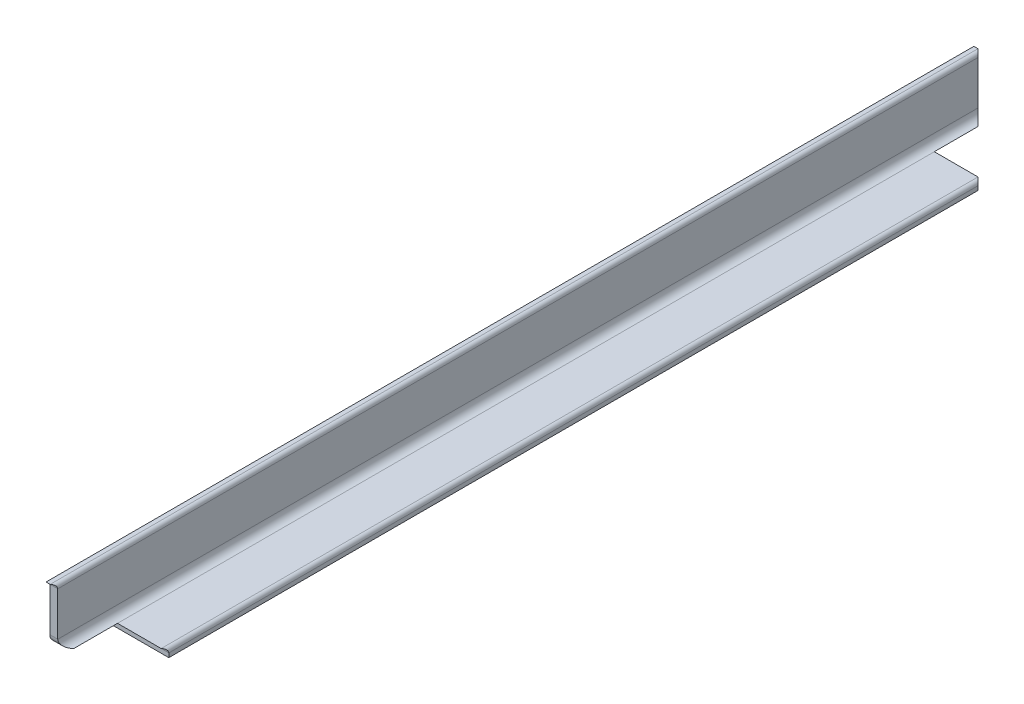
ISO-10303-21;
HEADER;
FILE_DESCRIPTION(('STEP AP214'),'2;1');
FILE_NAME('part.step','',(''),(''),'','','');
FILE_SCHEMA(('AUTOMOTIVE_DESIGN { 1 0 10303 214 1 1 1 1 }'));
ENDSEC;
DATA;
#1=APPLICATION_CONTEXT('core data for automotive mechanical design processes');
#2=APPLICATION_PROTOCOL_DEFINITION('international standard','automotive_design',2000,#1);
#3=PRODUCT_CONTEXT('',#1,'mechanical');
#4=PRODUCT('Part','Part','',(#3));
#5=PRODUCT_RELATED_PRODUCT_CATEGORY('part','',(#4));
#6=PRODUCT_DEFINITION_FORMATION('','',#4);
#7=PRODUCT_DEFINITION_CONTEXT('part definition',#1,'design');
#8=PRODUCT_DEFINITION('design','',#6,#7);
#9=PRODUCT_DEFINITION_SHAPE('','',#8);
#10=(LENGTH_UNIT() NAMED_UNIT(*) SI_UNIT(.MILLI.,.METRE.));
#11=(NAMED_UNIT(*) PLANE_ANGLE_UNIT() SI_UNIT($,.RADIAN.));
#12=(NAMED_UNIT(*) SI_UNIT($,.STERADIAN.) SOLID_ANGLE_UNIT());
#13=UNCERTAINTY_MEASURE_WITH_UNIT(LENGTH_MEASURE(1.E-05),#10,'distance_accuracy_value','');
#14=(GEOMETRIC_REPRESENTATION_CONTEXT(3) GLOBAL_UNCERTAINTY_ASSIGNED_CONTEXT((#13)) GLOBAL_UNIT_ASSIGNED_CONTEXT((#10,
#11,#12)) REPRESENTATION_CONTEXT('',''));
#15=CARTESIAN_POINT('',(0.,0.,0.));
#16=DIRECTION('',(0.,0.,1.));
#17=DIRECTION('',(1.,0.,0.));
#18=AXIS2_PLACEMENT_3D('',#15,#16,#17);
#19=CARTESIAN_POINT('',(396.7479999,4.76249999999992,35.8140001000004));
#20=DIRECTION('',(0.,1.,0.));
#21=DIRECTION('',(0.,0.,1.));
#22=AXIS2_PLACEMENT_3D('',#19,#20,#21);
#23=PLANE('',#22);
#24=DIRECTION('',(0.,0.,1.));
#25=VECTOR('',#24,1.);
#26=CARTESIAN_POINT('',(9.5885,4.7625,9.58850010000005));
#27=LINE('',#26,#25);
#28=CARTESIAN_POINT('',(9.5885,4.7625,9.58850010000005));
#29=VERTEX_POINT('',#28);
#30=CARTESIAN_POINT('',(9.5885,4.7625,35.8140001000001));
#31=VERTEX_POINT('',#30);
#32=EDGE_CURVE('E10',#29,#31,#27,.T.);
#33=ORIENTED_EDGE('',*,*,#32,.T.);
#34=DIRECTION('',(1.,0.,0.));
#35=VECTOR('',#34,1.);
#36=CARTESIAN_POINT('',(0.,4.76250000000002,35.8140001000001));
#37=LINE('',#36,#35);
#38=CARTESIAN_POINT('',(0.,4.76250000000002,35.8140001000001));
#39=VERTEX_POINT('',#38);
#40=EDGE_CURVE('E271',#39,#31,#37,.T.);
#41=ORIENTED_EDGE('',*,*,#40,.F.);
#42=DIRECTION('',(0.,0.,1.));
#43=VECTOR('',#42,1.);
#44=CARTESIAN_POINT('',(0.,4.7625,9.58850010000005));
#45=LINE('',#44,#43);
#46=CARTESIAN_POINT('',(0.,4.7625,9.58850010000005));
#47=VERTEX_POINT('',#46);
#48=EDGE_CURVE('E286',#47,#39,#45,.T.);
#49=ORIENTED_EDGE('',*,*,#48,.F.);
#50=DIRECTION('',(1.,0.,0.));
#51=VECTOR('',#50,1.);
#52=CARTESIAN_POINT('',(0.,4.7625,9.58850010000005));
#53=LINE('',#52,#51);
#54=EDGE_CURVE('E26',#47,#29,#53,.T.);
#55=ORIENTED_EDGE('',*,*,#54,.T.);
#56=EDGE_LOOP('',(#33,#41,#49,#55));
#57=FACE_BOUND('',#56,.T.);
#58=ADVANCED_FACE('F16',(#57),#23,.F.);
#59=CARTESIAN_POINT('',(396.7479999,9.58849999999993,9.58850010000038));
#60=DIRECTION('',(-1.,0.,0.));
#61=DIRECTION('',(0.,0.,1.));
#62=AXIS2_PLACEMENT_3D('',#59,#60,#61);
#63=CYLINDRICAL_SURFACE('',#62,4.826);
#64=CARTESIAN_POINT('',(9.58849999999997,9.5885,9.58850010000005));
#65=DIRECTION('',(0.707106781186547,0.,-0.707106781186548));
#66=DIRECTION('',(-0.707106781186548,0.,-0.707106781186547));
#67=AXIS2_PLACEMENT_3D('',#64,#65,#66);
#68=ELLIPSE('',#67,6.82499465201258,4.826);
#69=CARTESIAN_POINT('',(4.7625,9.5885,4.76250010000005));
#70=VERTEX_POINT('',#69);
#71=EDGE_CURVE('E197',#29,#70,#68,.T.);
#72=ORIENTED_EDGE('',*,*,#71,.F.);
#73=ORIENTED_EDGE('',*,*,#54,.F.);
#74=CARTESIAN_POINT('',(0.,9.5885,9.58850010000005));
#75=DIRECTION('',(-1.,0.,0.));
#76=DIRECTION('',(0.,0.,1.));
#77=AXIS2_PLACEMENT_3D('',#74,#75,#76);
#78=CIRCLE('',#77,4.826);
#79=CARTESIAN_POINT('',(0.,9.5885,4.76250010000005));
#80=VERTEX_POINT('',#79);
#81=EDGE_CURVE('E282',#80,#47,#78,.T.);
#82=ORIENTED_EDGE('',*,*,#81,.F.);
#83=DIRECTION('',(1.,0.,0.));
#84=VECTOR('',#83,1.);
#85=CARTESIAN_POINT('',(0.,9.5885,4.76250010000005));
#86=LINE('',#85,#84);
#87=EDGE_CURVE('E287',#80,#70,#86,.T.);
#88=ORIENTED_EDGE('',*,*,#87,.T.);
#89=EDGE_LOOP('',(#72,#73,#82,#88));
#90=FACE_BOUND('',#89,.T.);
#91=ADVANCED_FACE('F300',(#90),#63,.T.);
#92=CARTESIAN_POINT('',(396.7479999,9.58849999999993,4.76250010000041));
#93=DIRECTION('',(0.,0.,1.));
#94=DIRECTION('',(1.,0.,0.));
#95=AXIS2_PLACEMENT_3D('',#92,#93,#94);
#96=PLANE('',#95);
#97=DIRECTION('',(0.,1.,0.));
#98=VECTOR('',#97,1.);
#99=CARTESIAN_POINT('',(4.7625,9.5885,4.76250010000005));
#100=LINE('',#99,#98);
#101=CARTESIAN_POINT('',(4.7625,35.814,4.76250010000005));
#102=VERTEX_POINT('',#101);
#103=EDGE_CURVE('E200',#70,#102,#100,.T.);
#104=ORIENTED_EDGE('',*,*,#103,.F.);
#105=ORIENTED_EDGE('',*,*,#87,.F.);
#106=DIRECTION('',(0.,-1.,0.));
#107=VECTOR('',#106,1.);
#108=CARTESIAN_POINT('',(0.,35.814,4.76250010000005));
#109=LINE('',#108,#107);
#110=CARTESIAN_POINT('',(0.,35.814,4.76250010000003));
#111=VERTEX_POINT('',#110);
#112=EDGE_CURVE('E285',#111,#80,#109,.T.);
#113=ORIENTED_EDGE('',*,*,#112,.F.);
#114=DIRECTION('',(1.,0.,0.));
#115=VECTOR('',#114,1.);
#116=CARTESIAN_POINT('',(0.,35.814,4.76250010000005));
#117=LINE('',#116,#115);
#118=EDGE_CURVE('E276',#111,#102,#117,.T.);
#119=ORIENTED_EDGE('',*,*,#118,.T.);
#120=EDGE_LOOP('',(#104,#105,#113,#119));
#121=FACE_BOUND('',#120,.T.);
#122=ADVANCED_FACE('F295',(#121),#96,.F.);
#123=CARTESIAN_POINT('',(396.7479999,35.8139999999999,2.47650010000038));
#124=DIRECTION('',(-1.,0.,0.));
#125=DIRECTION('',(0.,0.,1.));
#126=AXIS2_PLACEMENT_3D('',#123,#124,#125);
#127=CYLINDRICAL_SURFACE('',#126,2.286);
#128=CARTESIAN_POINT('',(2.47649999999992,35.814,2.47650010000005));
#129=DIRECTION('',(-0.70710678118655,0.,0.707106781186545));
#130=DIRECTION('',(-0.707106781186545,0.,-0.70710678118655));
#131=AXIS2_PLACEMENT_3D('',#128,#129,#130);
#132=ELLIPSE('',#131,3.23289220358488,2.286);
#133=CARTESIAN_POINT('',(2.4765,38.1,2.47650010000005));
#134=VERTEX_POINT('',#133);
#135=EDGE_CURVE('E207',#102,#134,#132,.T.);
#136=ORIENTED_EDGE('',*,*,#135,.F.);
#137=ORIENTED_EDGE('',*,*,#118,.F.);
#138=CARTESIAN_POINT('',(0.,35.814,2.47650010000003));
#139=DIRECTION('',(1.,0.,0.));
#140=DIRECTION('',(0.,1.,0.));
#141=AXIS2_PLACEMENT_3D('',#138,#139,#140);
#142=CIRCLE('',#141,2.286);
#143=CARTESIAN_POINT('',(0.,38.1,2.47650010000003));
#144=VERTEX_POINT('',#143);
#145=EDGE_CURVE('E224',#144,#111,#142,.T.);
#146=ORIENTED_EDGE('',*,*,#145,.F.);
#147=DIRECTION('',(-1.,0.,0.));
#148=VECTOR('',#147,1.);
#149=CARTESIAN_POINT('',(2.4765,38.1000000000001,2.47650010000005));
#150=LINE('',#149,#148);
#151=EDGE_CURVE('E213',#134,#144,#150,.T.);
#152=ORIENTED_EDGE('',*,*,#151,.F.);
#153=EDGE_LOOP('',(#136,#137,#146,#152));
#154=FACE_BOUND('',#153,.T.);
#155=ADVANCED_FACE('F293',(#154),#127,.F.);
#156=CARTESIAN_POINT('',(396.7479999,2.47649999999992,35.8140001000004));
#157=DIRECTION('',(-1.,0.,0.));
#158=DIRECTION('',(0.,0.,1.));
#159=AXIS2_PLACEMENT_3D('',#156,#157,#158);
#160=CYLINDRICAL_SURFACE('',#159,2.286);
#161=CARTESIAN_POINT('',(35.814,2.4765,35.8140001000001));
#162=DIRECTION('',(-0.707106781186552,0.,0.707106781186543));
#163=DIRECTION('',(-0.707106781186543,0.,-0.707106781186552));
#164=AXIS2_PLACEMENT_3D('',#161,#162,#163);
#165=ELLIPSE('',#164,3.23289220358488,2.286);
#166=CARTESIAN_POINT('',(38.1,2.4765,38.1000001000001));
#167=VERTEX_POINT('',#166);
#168=CARTESIAN_POINT('',(35.814,4.7625,35.8140001000001));
#169=VERTEX_POINT('',#168);
#170=EDGE_CURVE('E144',#167,#169,#165,.T.);
#171=ORIENTED_EDGE('',*,*,#170,.F.);
#172=DIRECTION('',(1.,0.,0.));
#173=VECTOR('',#172,1.);
#174=CARTESIAN_POINT('',(0.,2.47650000000003,38.1000001000001));
#175=LINE('',#174,#173);
#176=CARTESIAN_POINT('',(0.,2.47650000000003,38.1000001000001));
#177=VERTEX_POINT('',#176);
#178=EDGE_CURVE('E269',#177,#167,#175,.T.);
#179=ORIENTED_EDGE('',*,*,#178,.F.);
#180=CARTESIAN_POINT('',(0.,2.47650000000003,35.8140001000001));
#181=DIRECTION('',(1.,0.,0.));
#182=DIRECTION('',(0.,1.,0.));
#183=AXIS2_PLACEMENT_3D('',#180,#181,#182);
#184=CIRCLE('',#183,2.286);
#185=EDGE_CURVE('E191',#39,#177,#184,.T.);
#186=ORIENTED_EDGE('',*,*,#185,.F.);
#187=ORIENTED_EDGE('',*,*,#40,.T.);
#188=DIRECTION('',(-1.,0.,0.));
#189=VECTOR('',#188,1.);
#190=CARTESIAN_POINT('',(35.814,4.76250000000018,35.8140001000001));
#191=LINE('',#190,#189);
#192=EDGE_CURVE('E35',#169,#31,#191,.T.);
#193=ORIENTED_EDGE('',*,*,#192,.F.);
#194=EDGE_LOOP('',(#171,#179,#186,#187,#193));
#195=FACE_BOUND('',#194,.T.);
#196=ADVANCED_FACE('F306',(#195),#160,.F.);
#197=CARTESIAN_POINT('',(396.7479999,0.,38.1000001000004));
#198=DIRECTION('',(0.,0.,1.));
#199=DIRECTION('',(1.,0.,0.));
#200=AXIS2_PLACEMENT_3D('',#197,#198,#199);
#201=PLANE('',#200);
#202=DIRECTION('',(0.,1.,0.));
#203=VECTOR('',#202,1.);
#204=CARTESIAN_POINT('',(38.1,0.,38.1000001000001));
#205=LINE('',#204,#203);
#206=CARTESIAN_POINT('',(38.1,0.,38.1000001000001));
#207=VERTEX_POINT('',#206);
#208=EDGE_CURVE('E135',#207,#167,#205,.T.);
#209=ORIENTED_EDGE('',*,*,#208,.F.);
#210=DIRECTION('',(1.,0.,0.));
#211=VECTOR('',#210,1.);
#212=CARTESIAN_POINT('',(0.,0.,38.1000001000001));
#213=LINE('',#212,#211);
#214=CARTESIAN_POINT('',(0.,0.,38.1000001000001));
#215=VERTEX_POINT('',#214);
#216=EDGE_CURVE('E155',#215,#207,#213,.T.);
#217=ORIENTED_EDGE('',*,*,#216,.F.);
#218=DIRECTION('',(0.,-1.,0.));
#219=VECTOR('',#218,1.);
#220=CARTESIAN_POINT('',(0.,2.47650000000003,38.1000001000001));
#221=LINE('',#220,#219);
#222=EDGE_CURVE('E161',#177,#215,#221,.T.);
#223=ORIENTED_EDGE('',*,*,#222,.F.);
#224=ORIENTED_EDGE('',*,*,#178,.T.);
#225=EDGE_LOOP('',(#209,#217,#223,#224));
#226=FACE_BOUND('',#225,.T.);
#227=ADVANCED_FACE('F307',(#226),#201,.F.);
#228=CARTESIAN_POINT('',(9.5885,9.5885,0.));
#229=DIRECTION('',(0.,0.,1.));
#230=DIRECTION('',(1.,0.,0.));
#231=AXIS2_PLACEMENT_3D('',#228,#229,#230);
#232=CYLINDRICAL_SURFACE('',#231,4.826);
#233=ORIENTED_EDGE('',*,*,#71,.T.);
#234=DIRECTION('',(0.,0.,1.));
#235=VECTOR('',#234,1.);
#236=CARTESIAN_POINT('',(4.7625,9.5885,4.76250010000005));
#237=LINE('',#236,#235);
#238=CARTESIAN_POINT('',(4.7625,9.58850000000003,557.2124999));
#239=VERTEX_POINT('',#238);
#240=EDGE_CURVE('E194',#70,#239,#237,.T.);
#241=ORIENTED_EDGE('',*,*,#240,.T.);
#242=CARTESIAN_POINT('',(9.58849999999997,9.58850000000003,552.3864999));
#243=DIRECTION('',(0.707106781186542,0.,0.707106781186553));
#244=DIRECTION('',(-0.707106781186553,0.,0.707106781186542));
#245=AXIS2_PLACEMENT_3D('',#242,#243,#244);
#246=ELLIPSE('',#245,6.82499465201261,4.826);
#247=CARTESIAN_POINT('',(9.5885,4.76250000000002,552.3864999));
#248=VERTEX_POINT('',#247);
#249=EDGE_CURVE('E198',#239,#248,#246,.T.);
#250=ORIENTED_EDGE('',*,*,#249,.T.);
#251=DIRECTION('',(0.,0.,1.));
#252=VECTOR('',#251,1.);
#253=CARTESIAN_POINT('',(9.5885,4.7625,526.1609999));
#254=LINE('',#253,#252);
#255=CARTESIAN_POINT('',(9.58849999999997,4.7625,526.1609999));
#256=VERTEX_POINT('',#255);
#257=EDGE_CURVE('E178',#256,#248,#254,.T.);
#258=ORIENTED_EDGE('',*,*,#257,.F.);
#259=DIRECTION('',(0.,0.,1.));
#260=VECTOR('',#259,1.);
#261=CARTESIAN_POINT('',(9.5885,4.7625,35.8140001000001));
#262=LINE('',#261,#260);
#263=EDGE_CURVE('E139',#31,#256,#262,.T.);
#264=ORIENTED_EDGE('',*,*,#263,.F.);
#265=ORIENTED_EDGE('',*,*,#32,.F.);
#266=EDGE_LOOP('',(#233,#241,#250,#258,#264,#265));
#267=FACE_BOUND('',#266,.T.);
#268=ADVANCED_FACE('F243',(#267),#232,.F.);
#269=CARTESIAN_POINT('',(4.7625,35.814,0.));
#270=DIRECTION('',(1.,0.,0.));
#271=DIRECTION('',(0.,0.,-1.));
#272=AXIS2_PLACEMENT_3D('',#269,#270,#271);
#273=PLANE('',#272);
#274=ORIENTED_EDGE('',*,*,#103,.T.);
#275=DIRECTION('',(0.,0.,1.));
#276=VECTOR('',#275,1.);
#277=CARTESIAN_POINT('',(4.7625,35.814,4.76250010000005));
#278=LINE('',#277,#276);
#279=CARTESIAN_POINT('',(4.7625,35.814,557.2124999));
#280=VERTEX_POINT('',#279);
#281=EDGE_CURVE('E202',#102,#280,#278,.T.);
#282=ORIENTED_EDGE('',*,*,#281,.T.);
#283=DIRECTION('',(0.,-1.,0.));
#284=VECTOR('',#283,1.);
#285=CARTESIAN_POINT('',(4.7625,35.814,557.2124999));
#286=LINE('',#285,#284);
#287=EDGE_CURVE('E205',#280,#239,#286,.T.);
#288=ORIENTED_EDGE('',*,*,#287,.T.);
#289=ORIENTED_EDGE('',*,*,#240,.F.);
#290=EDGE_LOOP('',(#274,#282,#288,#289));
#291=FACE_BOUND('',#290,.T.);
#292=ADVANCED_FACE('F250',(#291),#273,.T.);
#293=CARTESIAN_POINT('',(2.4765,35.814,0.));
#294=DIRECTION('',(0.,0.,1.));
#295=DIRECTION('',(1.,0.,0.));
#296=AXIS2_PLACEMENT_3D('',#293,#294,#295);
#297=CYLINDRICAL_SURFACE('',#296,2.286);
#298=ORIENTED_EDGE('',*,*,#135,.T.);
#299=DIRECTION('',(0.,0.,1.));
#300=VECTOR('',#299,1.);
#301=CARTESIAN_POINT('',(2.4765,38.1,2.47650010000005));
#302=LINE('',#301,#300);
#303=CARTESIAN_POINT('',(2.4765,38.1,559.4984999));
#304=VERTEX_POINT('',#303);
#305=EDGE_CURVE('E208',#134,#304,#302,.T.);
#306=ORIENTED_EDGE('',*,*,#305,.T.);
#307=CARTESIAN_POINT('',(2.4765,35.814,559.4984999));
#308=DIRECTION('',(-0.707106781186546,0.,-0.707106781186549));
#309=DIRECTION('',(-0.707106781186549,0.,0.707106781186546));
#310=AXIS2_PLACEMENT_3D('',#307,#308,#309);
#311=ELLIPSE('',#310,3.23289220358491,2.286);
#312=EDGE_CURVE('E211',#304,#280,#311,.T.);
#313=ORIENTED_EDGE('',*,*,#312,.T.);
#314=ORIENTED_EDGE('',*,*,#281,.F.);
#315=EDGE_LOOP('',(#298,#306,#313,#314));
#316=FACE_BOUND('',#315,.T.);
#317=ADVANCED_FACE('F291',(#316),#297,.T.);
#318=CARTESIAN_POINT('',(0.,38.1,0.));
#319=DIRECTION('',(0.,1.,0.));
#320=DIRECTION('',(0.,0.,1.));
#321=AXIS2_PLACEMENT_3D('',#318,#319,#320);
#322=PLANE('',#321);
#323=ORIENTED_EDGE('',*,*,#151,.T.);
#324=DIRECTION('',(0.,0.,1.));
#325=VECTOR('',#324,1.);
#326=CARTESIAN_POINT('',(0.,38.1,2.47650010000003));
#327=LINE('',#326,#325);
#328=CARTESIAN_POINT('',(0.,38.1,559.4984999));
#329=VERTEX_POINT('',#328);
#330=EDGE_CURVE('E214',#144,#329,#327,.T.);
#331=ORIENTED_EDGE('',*,*,#330,.T.);
#332=DIRECTION('',(-1.,0.,0.));
#333=VECTOR('',#332,1.);
#334=CARTESIAN_POINT('',(2.4765,38.1000000000001,559.4984999));
#335=LINE('',#334,#333);
#336=EDGE_CURVE('E218',#304,#329,#335,.T.);
#337=ORIENTED_EDGE('',*,*,#336,.F.);
#338=ORIENTED_EDGE('',*,*,#305,.F.);
#339=EDGE_LOOP('',(#323,#331,#337,#338));
#340=FACE_BOUND('',#339,.T.);
#341=ADVANCED_FACE('F263',(#340),#322,.T.);
#342=CARTESIAN_POINT('',(396.7479999,35.8139999999999,559.4984999));
#343=DIRECTION('',(-1.,0.,0.));
#344=DIRECTION('',(0.,0.,1.));
#345=AXIS2_PLACEMENT_3D('',#342,#343,#344);
#346=CYLINDRICAL_SURFACE('',#345,2.286);
#347=CARTESIAN_POINT('',(-5.6843422E-13,35.814,559.4984999));
#348=DIRECTION('',(1.,0.,0.));
#349=DIRECTION('',(0.,1.,0.));
#350=AXIS2_PLACEMENT_3D('',#347,#348,#349);
#351=CIRCLE('',#350,2.286);
#352=CARTESIAN_POINT('',(0.,35.814,557.2124999));
#353=VERTEX_POINT('',#352);
#354=EDGE_CURVE('E220',#353,#329,#351,.T.);
#355=ORIENTED_EDGE('',*,*,#354,.F.);
#356=DIRECTION('',(1.,0.,0.));
#357=VECTOR('',#356,1.);
#358=CARTESIAN_POINT('',(0.,35.814,557.2124999));
#359=LINE('',#358,#357);
#360=EDGE_CURVE('E217',#353,#280,#359,.T.);
#361=ORIENTED_EDGE('',*,*,#360,.T.);
#362=ORIENTED_EDGE('',*,*,#312,.F.);
#363=ORIENTED_EDGE('',*,*,#336,.T.);
#364=EDGE_LOOP('',(#355,#361,#362,#363));
#365=FACE_BOUND('',#364,.T.);
#366=ADVANCED_FACE('F256',(#365),#346,.F.);
#367=CARTESIAN_POINT('',(396.7479999,35.8139999999999,557.2124999));
#368=DIRECTION('',(0.,0.,-1.));
#369=DIRECTION('',(-1.,0.,0.));
#370=AXIS2_PLACEMENT_3D('',#367,#368,#369);
#371=PLANE('',#370);
#372=DIRECTION('',(0.,1.,0.));
#373=VECTOR('',#372,1.);
#374=CARTESIAN_POINT('',(0.,9.58850000000003,557.2124999));
#375=LINE('',#374,#373);
#376=CARTESIAN_POINT('',(0.,9.58850000000003,557.2124999));
#377=VERTEX_POINT('',#376);
#378=EDGE_CURVE('E223',#377,#353,#375,.T.);
#379=ORIENTED_EDGE('',*,*,#378,.F.);
#380=DIRECTION('',(1.,0.,0.));
#381=VECTOR('',#380,1.);
#382=CARTESIAN_POINT('',(0.,9.58850000000003,557.2124999));
#383=LINE('',#382,#381);
#384=EDGE_CURVE('E173',#377,#239,#383,.T.);
#385=ORIENTED_EDGE('',*,*,#384,.T.);
#386=ORIENTED_EDGE('',*,*,#287,.F.);
#387=ORIENTED_EDGE('',*,*,#360,.F.);
#388=EDGE_LOOP('',(#379,#385,#386,#387));
#389=FACE_BOUND('',#388,.T.);
#390=ADVANCED_FACE('F232',(#389),#371,.F.);
#391=CARTESIAN_POINT('',(396.7479999,2.47649999999992,523.8749999));
#392=DIRECTION('',(0.,0.,-1.));
#393=DIRECTION('',(-1.,0.,0.));
#394=AXIS2_PLACEMENT_3D('',#391,#392,#393);
#395=PLANE('',#394);
#396=DIRECTION('',(0.,1.,0.));
#397=VECTOR('',#396,1.);
#398=CARTESIAN_POINT('',(0.,0.,523.8749999));
#399=LINE('',#398,#397);
#400=CARTESIAN_POINT('',(0.,0.,523.8749999));
#401=VERTEX_POINT('',#400);
#402=CARTESIAN_POINT('',(0.,2.4765,523.8749999));
#403=VERTEX_POINT('',#402);
#404=EDGE_CURVE('E168',#401,#403,#399,.T.);
#405=ORIENTED_EDGE('',*,*,#404,.F.);
#406=DIRECTION('',(-1.,0.,0.));
#407=VECTOR('',#406,1.);
#408=CARTESIAN_POINT('',(38.1,0.,523.8749999));
#409=LINE('',#408,#407);
#410=CARTESIAN_POINT('',(38.1,0.,523.8749999));
#411=VERTEX_POINT('',#410);
#412=EDGE_CURVE('E156',#411,#401,#409,.T.);
#413=ORIENTED_EDGE('',*,*,#412,.F.);
#414=DIRECTION('',(0.,-1.,0.));
#415=VECTOR('',#414,1.);
#416=CARTESIAN_POINT('',(38.1,2.4765,523.8749999));
#417=LINE('',#416,#415);
#418=CARTESIAN_POINT('',(38.1,2.4765,523.8749999));
#419=VERTEX_POINT('',#418);
#420=EDGE_CURVE('E152',#419,#411,#417,.T.);
#421=ORIENTED_EDGE('',*,*,#420,.F.);
#422=DIRECTION('',(1.,0.,0.));
#423=VECTOR('',#422,1.);
#424=CARTESIAN_POINT('',(0.,2.4765,523.8749999));
#425=LINE('',#424,#423);
#426=EDGE_CURVE('E129',#403,#419,#425,.T.);
#427=ORIENTED_EDGE('',*,*,#426,.F.);
#428=EDGE_LOOP('',(#405,#413,#421,#427));
#429=FACE_BOUND('',#428,.T.);
#430=ADVANCED_FACE('F310',(#429),#395,.F.);
#431=CARTESIAN_POINT('',(396.7479999,2.47649999999992,526.1609999));
#432=DIRECTION('',(-1.,0.,0.));
#433=DIRECTION('',(0.,0.,1.));
#434=AXIS2_PLACEMENT_3D('',#431,#432,#433);
#435=CYLINDRICAL_SURFACE('',#434,2.286);
#436=CARTESIAN_POINT('',(-4.97380006E-13,2.4765,526.1609999));
#437=DIRECTION('',(1.,0.,0.));
#438=DIRECTION('',(0.,1.,0.));
#439=AXIS2_PLACEMENT_3D('',#436,#437,#438);
#440=CIRCLE('',#439,2.286);
#441=CARTESIAN_POINT('',(0.,4.7625,526.1609999));
#442=VERTEX_POINT('',#441);
#443=EDGE_CURVE('E174',#403,#442,#440,.T.);
#444=ORIENTED_EDGE('',*,*,#443,.F.);
#445=ORIENTED_EDGE('',*,*,#426,.T.);
#446=CARTESIAN_POINT('',(35.814,2.4765,526.1609999));
#447=DIRECTION('',(-0.707106781186543,0.,-0.707106781186552));
#448=DIRECTION('',(-0.707106781186552,0.,0.707106781186543));
#449=AXIS2_PLACEMENT_3D('',#446,#447,#448);
#450=ELLIPSE('',#449,3.23289220358491,2.286);
#451=CARTESIAN_POINT('',(35.814,4.7625,526.1609999));
#452=VERTEX_POINT('',#451);
#453=EDGE_CURVE('E121',#452,#419,#450,.T.);
#454=ORIENTED_EDGE('',*,*,#453,.F.);
#455=DIRECTION('',(-1.,0.,0.));
#456=VECTOR('',#455,1.);
#457=CARTESIAN_POINT('',(35.814,4.76250000000018,526.1609999));
#458=LINE('',#457,#456);
#459=EDGE_CURVE('E126',#452,#256,#458,.T.);
#460=ORIENTED_EDGE('',*,*,#459,.T.);
#461=DIRECTION('',(1.,0.,0.));
#462=VECTOR('',#461,1.);
#463=CARTESIAN_POINT('',(0.,4.7625,526.1609999));
#464=LINE('',#463,#462);
#465=EDGE_CURVE('E141',#442,#256,#464,.T.);
#466=ORIENTED_EDGE('',*,*,#465,.F.);
#467=EDGE_LOOP('',(#444,#445,#454,#460,#466));
#468=FACE_BOUND('',#467,.T.);
#469=ADVANCED_FACE('F124',(#468),#435,.F.);
#470=CARTESIAN_POINT('',(396.7479999,4.76249999999992,552.3864999));
#471=DIRECTION('',(0.,1.,0.));
#472=DIRECTION('',(0.,0.,1.));
#473=AXIS2_PLACEMENT_3D('',#470,#471,#472);
#474=PLANE('',#473);
#475=DIRECTION('',(0.,0.,1.));
#476=VECTOR('',#475,1.);
#477=CARTESIAN_POINT('',(0.,4.7625,526.1609999));
#478=LINE('',#477,#476);
#479=CARTESIAN_POINT('',(0.,4.76250000000002,552.3864999));
#480=VERTEX_POINT('',#479);
#481=EDGE_CURVE('E175',#442,#480,#478,.T.);
#482=ORIENTED_EDGE('',*,*,#481,.F.);
#483=ORIENTED_EDGE('',*,*,#465,.T.);
#484=ORIENTED_EDGE('',*,*,#257,.T.);
#485=DIRECTION('',(1.,0.,0.));
#486=VECTOR('',#485,1.);
#487=CARTESIAN_POINT('',(0.,4.76250000000002,552.3864999));
#488=LINE('',#487,#486);
#489=EDGE_CURVE('E180',#480,#248,#488,.T.);
#490=ORIENTED_EDGE('',*,*,#489,.F.);
#491=EDGE_LOOP('',(#482,#483,#484,#490));
#492=FACE_BOUND('',#491,.T.);
#493=ADVANCED_FACE('F240',(#492),#474,.F.);
#494=CARTESIAN_POINT('',(396.7479999,9.58849999999993,552.3864999));
#495=DIRECTION('',(-1.,0.,0.));
#496=DIRECTION('',(0.,0.,1.));
#497=AXIS2_PLACEMENT_3D('',#494,#495,#496);
#498=CYLINDRICAL_SURFACE('',#497,4.826);
#499=CARTESIAN_POINT('',(-5.6843422E-13,9.58850000000003,552.3864999));
#500=DIRECTION('',(-1.,0.,0.));
#501=DIRECTION('',(0.,0.,1.));
#502=AXIS2_PLACEMENT_3D('',#499,#500,#501);
#503=CIRCLE('',#502,4.826);
#504=EDGE_CURVE('E149',#480,#377,#503,.T.);
#505=ORIENTED_EDGE('',*,*,#504,.F.);
#506=ORIENTED_EDGE('',*,*,#489,.T.);
#507=ORIENTED_EDGE('',*,*,#249,.F.);
#508=ORIENTED_EDGE('',*,*,#384,.F.);
#509=EDGE_LOOP('',(#505,#506,#507,#508));
#510=FACE_BOUND('',#509,.T.);
#511=ADVANCED_FACE('F235',(#510),#498,.T.);
#512=CARTESIAN_POINT('',(9.5885,4.7625,0.));
#513=DIRECTION('',(0.,1.,0.));
#514=DIRECTION('',(0.,0.,1.));
#515=AXIS2_PLACEMENT_3D('',#512,#513,#514);
#516=PLANE('',#515);
#517=ORIENTED_EDGE('',*,*,#192,.T.);
#518=ORIENTED_EDGE('',*,*,#263,.T.);
#519=ORIENTED_EDGE('',*,*,#459,.F.);
#520=DIRECTION('',(0.,0.,1.));
#521=VECTOR('',#520,1.);
#522=CARTESIAN_POINT('',(35.814,4.7625,35.8140001000001));
#523=LINE('',#522,#521);
#524=EDGE_CURVE('E134',#169,#452,#523,.T.);
#525=ORIENTED_EDGE('',*,*,#524,.F.);
#526=EDGE_LOOP('',(#517,#518,#519,#525));
#527=FACE_BOUND('',#526,.T.);
#528=ADVANCED_FACE('F137',(#527),#516,.T.);
#529=CARTESIAN_POINT('',(35.814,2.47650000000003,0.));
#530=DIRECTION('',(0.,0.,1.));
#531=DIRECTION('',(1.,0.,0.));
#532=AXIS2_PLACEMENT_3D('',#529,#530,#531);
#533=CYLINDRICAL_SURFACE('',#532,2.286);
#534=ORIENTED_EDGE('',*,*,#170,.T.);
#535=ORIENTED_EDGE('',*,*,#524,.T.);
#536=ORIENTED_EDGE('',*,*,#453,.T.);
#537=DIRECTION('',(0.,0.,1.));
#538=VECTOR('',#537,1.);
#539=CARTESIAN_POINT('',(38.1,2.47650000000003,38.1000001000001));
#540=LINE('',#539,#538);
#541=EDGE_CURVE('E151',#167,#419,#540,.T.);
#542=ORIENTED_EDGE('',*,*,#541,.F.);
#543=EDGE_LOOP('',(#534,#535,#536,#542));
#544=FACE_BOUND('',#543,.T.);
#545=ADVANCED_FACE('F18',(#544),#533,.T.);
#546=CARTESIAN_POINT('',(38.1,2.47650000000003,0.));
#547=DIRECTION('',(1.,0.,0.));
#548=DIRECTION('',(0.,0.,-1.));
#549=AXIS2_PLACEMENT_3D('',#546,#547,#548);
#550=PLANE('',#549);
#551=ORIENTED_EDGE('',*,*,#208,.T.);
#552=ORIENTED_EDGE('',*,*,#541,.T.);
#553=ORIENTED_EDGE('',*,*,#420,.T.);
#554=DIRECTION('',(0.,0.,1.));
#555=VECTOR('',#554,1.);
#556=CARTESIAN_POINT('',(38.1,0.,38.1000001000001));
#557=LINE('',#556,#555);
#558=EDGE_CURVE('E153',#207,#411,#557,.T.);
#559=ORIENTED_EDGE('',*,*,#558,.F.);
#560=EDGE_LOOP('',(#551,#552,#553,#559));
#561=FACE_BOUND('',#560,.T.);
#562=ADVANCED_FACE('F312',(#561),#550,.T.);
#563=CARTESIAN_POINT('',(38.1,0.,0.));
#564=DIRECTION('',(0.,-1.,0.));
#565=DIRECTION('',(0.,0.,-1.));
#566=AXIS2_PLACEMENT_3D('',#563,#564,#565);
#567=PLANE('',#566);
#568=ORIENTED_EDGE('',*,*,#216,.T.);
#569=ORIENTED_EDGE('',*,*,#558,.T.);
#570=ORIENTED_EDGE('',*,*,#412,.T.);
#571=DIRECTION('',(0.,0.,1.));
#572=VECTOR('',#571,1.);
#573=CARTESIAN_POINT('',(0.,0.,38.1000001000001));
#574=LINE('',#573,#572);
#575=EDGE_CURVE('E20',#215,#401,#574,.T.);
#576=ORIENTED_EDGE('',*,*,#575,.F.);
#577=EDGE_LOOP('',(#568,#569,#570,#576));
#578=FACE_BOUND('',#577,.T.);
#579=ADVANCED_FACE('F308',(#578),#567,.T.);
#580=CARTESIAN_POINT('',(0.,0.,0.));
#581=DIRECTION('',(-1.,0.,0.));
#582=DIRECTION('',(0.,0.,1.));
#583=AXIS2_PLACEMENT_3D('',#580,#581,#582);
#584=PLANE('',#583);
#585=ORIENTED_EDGE('',*,*,#222,.T.);
#586=ORIENTED_EDGE('',*,*,#575,.T.);
#587=ORIENTED_EDGE('',*,*,#404,.T.);
#588=ORIENTED_EDGE('',*,*,#443,.T.);
#589=ORIENTED_EDGE('',*,*,#481,.T.);
#590=ORIENTED_EDGE('',*,*,#504,.T.);
#591=ORIENTED_EDGE('',*,*,#378,.T.);
#592=ORIENTED_EDGE('',*,*,#354,.T.);
#593=ORIENTED_EDGE('',*,*,#330,.F.);
#594=ORIENTED_EDGE('',*,*,#145,.T.);
#595=ORIENTED_EDGE('',*,*,#112,.T.);
#596=ORIENTED_EDGE('',*,*,#81,.T.);
#597=ORIENTED_EDGE('',*,*,#48,.T.);
#598=ORIENTED_EDGE('',*,*,#185,.T.);
#599=EDGE_LOOP('',(#585,#586,#587,#588,#589,#590,#591,#592,#593,#594,#595,#596,#597,#598));
#600=FACE_BOUND('',#599,.T.);
#601=ADVANCED_FACE('F237',(#600),#584,.T.);
#602=CLOSED_SHELL('',(#58,#91,#122,#155,#196,#227,#268,#292,#317,#341,#366,#390,#430,#469,#493,
#511,#528,#545,#562,#579,#601));
#603=MANIFOLD_SOLID_BREP('B1',#602);
#604=ADVANCED_BREP_SHAPE_REPRESENTATION('',(#18,#603),#14);
#605=SHAPE_DEFINITION_REPRESENTATION(#9,#604);
ENDSEC;
END-ISO-10303-21;
